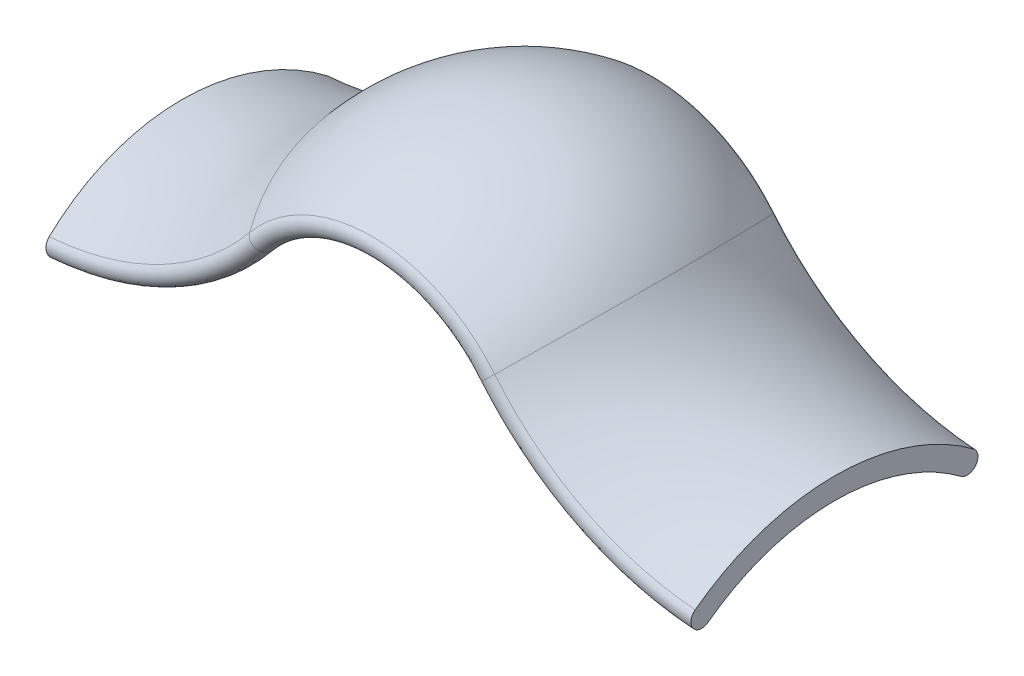
ISO-10303-21;
HEADER;
FILE_DESCRIPTION(('STEP AP214'),'2;1');
FILE_NAME('part.step','',(''),(''),'','','');
FILE_SCHEMA(('AUTOMOTIVE_DESIGN { 1 0 10303 214 1 1 1 1 }'));
ENDSEC;
DATA;
#1=APPLICATION_CONTEXT('core data for automotive mechanical design processes');
#2=APPLICATION_PROTOCOL_DEFINITION('international standard','automotive_design',2000,#1);
#3=PRODUCT_CONTEXT('',#1,'mechanical');
#4=PRODUCT('Part','Part','',(#3));
#5=PRODUCT_RELATED_PRODUCT_CATEGORY('part','',(#4));
#6=PRODUCT_DEFINITION_FORMATION('','',#4);
#7=PRODUCT_DEFINITION_CONTEXT('part definition',#1,'design');
#8=PRODUCT_DEFINITION('design','',#6,#7);
#9=PRODUCT_DEFINITION_SHAPE('','',#8);
#10=(LENGTH_UNIT() NAMED_UNIT(*) SI_UNIT(.MILLI.,.METRE.));
#11=(NAMED_UNIT(*) PLANE_ANGLE_UNIT() SI_UNIT($,.RADIAN.));
#12=(NAMED_UNIT(*) SI_UNIT($,.STERADIAN.) SOLID_ANGLE_UNIT());
#13=UNCERTAINTY_MEASURE_WITH_UNIT(LENGTH_MEASURE(1.E-05),#10,'distance_accuracy_value','');
#14=(GEOMETRIC_REPRESENTATION_CONTEXT(3) GLOBAL_UNCERTAINTY_ASSIGNED_CONTEXT((#13)) GLOBAL_UNIT_ASSIGNED_CONTEXT((#10,
#11,#12)) REPRESENTATION_CONTEXT('',''));
#15=CARTESIAN_POINT('',(0.,0.,0.));
#16=DIRECTION('',(0.,0.,1.));
#17=DIRECTION('',(1.,0.,0.));
#18=AXIS2_PLACEMENT_3D('',#15,#16,#17);
#19=CARTESIAN_POINT('',(-34.5983191968953,-0.818303723281441,0.));
#20=DIRECTION('',(0.577992953239305,0.816041755062635,0.));
#21=DIRECTION('',(0.,0.,-1.));
#22=AXIS2_PLACEMENT_3D('',#19,#20,#21);
#23=CIRCLE('',#22,27.4169496610841);
#24=CARTESIAN_POINT('',(-78.5719911577093,33.2344435861792,0.));
#25=DIRECTION('',(0.,0.,-1.));
#26=AXIS1_PLACEMENT('',#24,#25);
#27=SURFACE_OF_REVOLUTION('',#23,#26);
#28=CARTESIAN_POINT('',(-52.5245550481321,11.8786421570496,-16.4050834266758));
#29=VERTEX_POINT('',#28);
#30=CARTESIAN_POINT('',(-52.5245550481321,11.8786421570496,16.4050834266758));
#31=VERTEX_POINT('',#30);
#32=EDGE_CURVE('E157',#29,#31,#23,.T.);
#33=ORIENTED_EDGE('',*,*,#32,.F.);
#34=CARTESIAN_POINT('',(-78.5719911577093,33.2344435861792,-16.4050834266758));
#35=DIRECTION('',(0.,0.,-1.));
#36=DIRECTION('',(-1.,0.,0.));
#37=AXIS2_PLACEMENT_3D('',#34,#35,#36);
#38=CIRCLE('',#37,33.6829212296516);
#39=CARTESIAN_POINT('',(-76.1481835235366,-0.361156410181113,-16.4050834266758));
#40=VERTEX_POINT('',#39);
#41=EDGE_CURVE('E39',#29,#40,#38,.T.);
#42=ORIENTED_EDGE('',*,*,#41,.T.);
#43=CARTESIAN_POINT('',(-73.0283979719381,-22.105794935442,0.));
#44=DIRECTION('',(0.989863858347722,0.142019512521912,0.));
#45=DIRECTION('',(0.,0.,-1.));
#46=AXIS2_PLACEMENT_3D('',#43,#44,#45);
#47=CIRCLE('',#46,27.4169496610841);
#48=CARTESIAN_POINT('',(-76.1481835235366,-0.361156410181147,16.4050834266758));
#49=VERTEX_POINT('',#48);
#50=EDGE_CURVE('E46',#40,#49,#47,.T.);
#51=ORIENTED_EDGE('',*,*,#50,.T.);
#52=CARTESIAN_POINT('',(-78.5719911577093,33.2344435861792,16.4050834266758));
#53=DIRECTION('',(0.,0.,-1.));
#54=DIRECTION('',(-1.,0.,0.));
#55=AXIS2_PLACEMENT_3D('',#52,#53,#54);
#56=CIRCLE('',#55,33.6829212296517);
#57=EDGE_CURVE('E11',#31,#49,#56,.T.);
#58=ORIENTED_EDGE('',*,*,#57,.F.);
#59=EDGE_LOOP('',(#33,#42,#51,#58));
#60=FACE_BOUND('',#59,.T.);
#61=ADVANCED_FACE('F31',(#60),#27,.T.);
#62=CARTESIAN_POINT('',(-51.6941811439415,11.2904979080594,-15.6451719044451));
#63=DIRECTION('',(0.577992953239305,0.816041755062635,0.));
#64=DIRECTION('',(0.,0.,-1.));
#65=AXIS2_PLACEMENT_3D('',#62,#63,#64);
#66=CIRCLE('',#65,1.27);
#67=CARTESIAN_POINT('',(-78.5719911577093,33.2344435861792,0.));
#68=DIRECTION('',(0.,0.,-1.));
#69=AXIS1_PLACEMENT('',#67,#68);
#70=SURFACE_OF_REVOLUTION('',#66,#69);
#71=CARTESIAN_POINT('',(-50.863807239751,10.7023536590692,-14.8852603822143));
#72=VERTEX_POINT('',#71);
#73=EDGE_CURVE('E192',#72,#29,#66,.T.);
#74=ORIENTED_EDGE('',*,*,#73,.F.);
#75=CARTESIAN_POINT('',(-78.5719911577093,33.2344435861792,-14.8852603822143));
#76=DIRECTION('',(0.,0.,-1.));
#77=DIRECTION('',(-1.,0.,0.));
#78=AXIS2_PLACEMENT_3D('',#75,#76,#77);
#79=CIRCLE('',#78,35.7132822982539);
#80=CARTESIAN_POINT('',(-75.8591559183866,-2.37565410364841,-14.8852603822143));
#81=VERTEX_POINT('',#80);
#82=EDGE_CURVE('E203',#72,#81,#79,.T.);
#83=ORIENTED_EDGE('',*,*,#82,.T.);
#84=CARTESIAN_POINT('',(-76.0036697209616,-1.36840525691477,-15.6451719044451));
#85=DIRECTION('',(0.989863858347722,0.142019512521912,0.));
#86=DIRECTION('',(0.,0.,-1.));
#87=AXIS2_PLACEMENT_3D('',#84,#85,#86);
#88=CIRCLE('',#87,1.27);
#89=EDGE_CURVE('E54',#81,#40,#88,.T.);
#90=ORIENTED_EDGE('',*,*,#89,.T.);
#91=ORIENTED_EDGE('',*,*,#41,.F.);
#92=EDGE_LOOP('',(#74,#83,#90,#91));
#93=FACE_BOUND('',#92,.T.);
#94=ADVANCED_FACE('F195',(#93),#70,.T.);
#95=CARTESIAN_POINT('',(-34.5983191968953,-0.818303723281441,0.));
#96=DIRECTION('',(-0.577992953239305,-0.816041755062635,0.));
#97=DIRECTION('',(0.,0.,-1.));
#98=AXIS2_PLACEMENT_3D('',#95,#96,#97);
#99=CIRCLE('',#98,24.8769496610841);
#100=CARTESIAN_POINT('',(-78.5719911577093,33.2344435861792,0.));
#101=DIRECTION('',(0.,0.,-1.));
#102=AXIS1_PLACEMENT('',#100,#101);
#103=SURFACE_OF_REVOLUTION('',#99,#102);
#104=CARTESIAN_POINT('',(-50.8638072397509,10.7023536590692,14.8852603822143));
#105=VERTEX_POINT('',#104);
#106=EDGE_CURVE('E187',#105,#72,#99,.T.);
#107=ORIENTED_EDGE('',*,*,#106,.F.);
#108=CARTESIAN_POINT('',(-78.5719911577093,33.2344435861792,14.8852603822143));
#109=DIRECTION('',(0.,0.,-1.));
#110=DIRECTION('',(-1.,0.,0.));
#111=AXIS2_PLACEMENT_3D('',#108,#109,#110);
#112=CIRCLE('',#111,35.7132822982539);
#113=CARTESIAN_POINT('',(-75.8591559183866,-2.37565410364844,14.8852603822143));
#114=VERTEX_POINT('',#113);
#115=EDGE_CURVE('E228',#105,#114,#112,.T.);
#116=ORIENTED_EDGE('',*,*,#115,.T.);
#117=CARTESIAN_POINT('',(-73.0283979719381,-22.105794935442,0.));
#118=DIRECTION('',(-0.989863858347722,-0.142019512521912,0.));
#119=DIRECTION('',(0.,0.,-1.));
#120=AXIS2_PLACEMENT_3D('',#117,#118,#119);
#121=CIRCLE('',#120,24.8769496610841);
#122=EDGE_CURVE('E224',#114,#81,#121,.T.);
#123=ORIENTED_EDGE('',*,*,#122,.T.);
#124=ORIENTED_EDGE('',*,*,#82,.F.);
#125=EDGE_LOOP('',(#107,#116,#123,#124));
#126=FACE_BOUND('',#125,.T.);
#127=ADVANCED_FACE('F180',(#126),#103,.T.);
#128=CARTESIAN_POINT('',(-51.6941811439415,11.2904979080594,15.6451719044451));
#129=DIRECTION('',(0.577992953239305,0.816041755062635,0.));
#130=DIRECTION('',(0.,0.,1.));
#131=AXIS2_PLACEMENT_3D('',#128,#129,#130);
#132=CIRCLE('',#131,1.27);
#133=CARTESIAN_POINT('',(-78.5719911577093,33.2344435861792,0.));
#134=DIRECTION('',(0.,0.,-1.));
#135=AXIS1_PLACEMENT('',#133,#134);
#136=SURFACE_OF_REVOLUTION('',#132,#135);
#137=EDGE_CURVE('E183',#31,#105,#132,.T.);
#138=ORIENTED_EDGE('',*,*,#137,.F.);
#139=ORIENTED_EDGE('',*,*,#57,.T.);
#140=CARTESIAN_POINT('',(-76.0036697209616,-1.36840525691478,15.6451719044451));
#141=DIRECTION('',(0.989863858347722,0.142019512521912,0.));
#142=DIRECTION('',(0.,0.,1.));
#143=AXIS2_PLACEMENT_3D('',#140,#141,#142);
#144=CIRCLE('',#143,1.27);
#145=EDGE_CURVE('E222',#49,#114,#144,.T.);
#146=ORIENTED_EDGE('',*,*,#145,.T.);
#147=ORIENTED_EDGE('',*,*,#115,.F.);
#148=EDGE_LOOP('',(#138,#139,#146,#147));
#149=FACE_BOUND('',#148,.T.);
#150=ADVANCED_FACE('F175',(#149),#136,.T.);
#151=CARTESIAN_POINT('',(-37.166912119735,-0.984155770539181,-27.2139110541104));
#152=CARTESIAN_POINT('',(-5.62513185381765,28.9209200001234,-21.894591887005));
#153=CARTESIAN_POINT('',(-5.62513185381765,28.9209200001234,21.894591887005));
#154=CARTESIAN_POINT('',(-37.166912119735,-0.984155770539184,27.2139110541104));
#155=(BOUNDED_CURVE() B_SPLINE_CURVE(3,(#151,#152,#153,#154),.UNSPECIFIED.,.F.,
.F.) B_SPLINE_CURVE_WITH_KNOTS((4,4),(0.,1.),
.UNSPECIFIED.) CURVE() GEOMETRIC_REPRESENTATION_ITEM() RATIONAL_B_SPLINE_CURVE((1.,
0.414317093989202,0.414317093989202,1.)) REPRESENTATION_ITEM(''));
#156=CARTESIAN_POINT('',(-38.1,0.,0.));
#157=DIRECTION('',(0.,0.,1.));
#158=AXIS1_PLACEMENT('',#156,#157);
#159=SURFACE_OF_REVOLUTION('',#155,#158);
#160=CARTESIAN_POINT('',(-39.5837964140581,-3.27562782257029,0.));
#161=DIRECTION('',(0.688028187042774,-0.725683962779,0.));
#162=DIRECTION('',(0.,0.,-1.));
#163=AXIS2_PLACEMENT_3D('',#160,#161,#162);
#164=CIRCLE('',#163,27.4169496610841);
#165=CARTESIAN_POINT('',(-23.6424774931433,11.8384952927119,-16.4050834266758));
#166=VERTEX_POINT('',#165);
#167=CARTESIAN_POINT('',(-23.6424774931433,11.8384952927119,16.4050834266758));
#168=VERTEX_POINT('',#167);
#169=EDGE_CURVE('E109',#166,#168,#164,.T.);
#170=ORIENTED_EDGE('',*,*,#169,.F.);
#171=CARTESIAN_POINT('',(-38.1,0.,-16.4050834266758));
#172=DIRECTION('',(0.,0.,1.));
#173=DIRECTION('',(1.,0.,0.));
#174=AXIS2_PLACEMENT_3D('',#171,#172,#173);
#175=CIRCLE('',#174,18.6860891529456);
#176=EDGE_CURVE('E216',#166,#29,#175,.T.);
#177=ORIENTED_EDGE('',*,*,#176,.T.);
#178=ORIENTED_EDGE('',*,*,#32,.T.);
#179=CARTESIAN_POINT('',(-38.1,0.,16.4050834266758));
#180=DIRECTION('',(0.,0.,1.));
#181=DIRECTION('',(1.,0.,0.));
#182=AXIS2_PLACEMENT_3D('',#179,#180,#181);
#183=CIRCLE('',#182,18.6860891529455);
#184=EDGE_CURVE('E217',#168,#31,#183,.T.);
#185=ORIENTED_EDGE('',*,*,#184,.F.);
#186=EDGE_LOOP('',(#170,#177,#178,#185));
#187=FACE_BOUND('',#186,.T.);
#188=ADVANCED_FACE('F172',(#187),#159,.T.);
#189=CARTESIAN_POINT('',(-24.3809066502825,11.1383832600574,-15.6451719044451));
#190=DIRECTION('',(0.688028187042774,-0.725683962779,0.));
#191=DIRECTION('',(0.,0.,-1.));
#192=AXIS2_PLACEMENT_3D('',#189,#190,#191);
#193=CIRCLE('',#192,1.27);
#194=CARTESIAN_POINT('',(-38.1,0.,0.));
#195=DIRECTION('',(0.,0.,1.));
#196=AXIS1_PLACEMENT('',#194,#195);
#197=SURFACE_OF_REVOLUTION('',#193,#196);
#198=CARTESIAN_POINT('',(-25.1193358074217,10.4382712274029,-14.8852603822143));
#199=VERTEX_POINT('',#198);
#200=EDGE_CURVE('E215',#199,#166,#193,.T.);
#201=ORIENTED_EDGE('',*,*,#200,.F.);
#202=CARTESIAN_POINT('',(-38.1,0.,-14.8852603822143));
#203=DIRECTION('',(0.,0.,1.));
#204=DIRECTION('',(1.,0.,0.));
#205=AXIS2_PLACEMENT_3D('',#202,#203,#204);
#206=CIRCLE('',#205,16.6569849942092);
#207=EDGE_CURVE('E211',#199,#72,#206,.T.);
#208=ORIENTED_EDGE('',*,*,#207,.T.);
#209=ORIENTED_EDGE('',*,*,#73,.T.);
#210=ORIENTED_EDGE('',*,*,#176,.F.);
#211=EDGE_LOOP('',(#201,#208,#209,#210));
#212=FACE_BOUND('',#211,.T.);
#213=ADVANCED_FACE('F150',(#212),#197,.T.);
#214=CARTESIAN_POINT('',(-37.166912119735,-0.984155770539186,24.6530008433603));
#215=CARTESIAN_POINT('',(-9.19746511569019,25.5339552830496,19.4461528676298));
#216=CARTESIAN_POINT('',(-9.19746511569019,25.5339552830496,-19.4461528676298));
#217=CARTESIAN_POINT('',(-37.166912119735,-0.98415577053918,-24.6530008433603));
#218=(BOUNDED_CURVE() B_SPLINE_CURVE(3,(#214,#215,#216,#217),.UNSPECIFIED.,.F.,
.F.) B_SPLINE_CURVE_WITH_KNOTS((4,4),(0.,1.),
.UNSPECIFIED.) CURVE() GEOMETRIC_REPRESENTATION_ITEM() RATIONAL_B_SPLINE_CURVE((1.,
0.422585742471764,0.422585742471764,1.)) REPRESENTATION_ITEM(''));
#219=CARTESIAN_POINT('',(-38.1,0.,0.));
#220=DIRECTION('',(0.,0.,1.));
#221=AXIS1_PLACEMENT('',#219,#220);
#222=SURFACE_OF_REVOLUTION('',#218,#221);
#223=CARTESIAN_POINT('',(-39.5837964140581,-3.27562782257029,0.));
#224=DIRECTION('',(-0.688028187042774,0.725683962779,0.));
#225=DIRECTION('',(0.,0.,-1.));
#226=AXIS2_PLACEMENT_3D('',#223,#224,#225);
#227=CIRCLE('',#226,24.8769496610841);
#228=CARTESIAN_POINT('',(-25.1193358074217,10.4382712274028,14.8852603822143));
#229=VERTEX_POINT('',#228);
#230=EDGE_CURVE('E130',#229,#199,#227,.T.);
#231=ORIENTED_EDGE('',*,*,#230,.F.);
#232=CARTESIAN_POINT('',(-38.1,0.,14.8852603822143));
#233=DIRECTION('',(0.,0.,1.));
#234=DIRECTION('',(1.,0.,0.));
#235=AXIS2_PLACEMENT_3D('',#232,#233,#234);
#236=CIRCLE('',#235,16.6569849942092);
#237=EDGE_CURVE('E167',#229,#105,#236,.T.);
#238=ORIENTED_EDGE('',*,*,#237,.T.);
#239=ORIENTED_EDGE('',*,*,#106,.T.);
#240=ORIENTED_EDGE('',*,*,#207,.F.);
#241=EDGE_LOOP('',(#231,#238,#239,#240));
#242=FACE_BOUND('',#241,.T.);
#243=ADVANCED_FACE('F142',(#242),#222,.T.);
#244=CARTESIAN_POINT('',(-24.3809066502825,11.1383832600574,15.6451719044451));
#245=DIRECTION('',(0.688028187042774,-0.725683962779,0.));
#246=DIRECTION('',(0.,0.,1.));
#247=AXIS2_PLACEMENT_3D('',#244,#245,#246);
#248=CIRCLE('',#247,1.27);
#249=CARTESIAN_POINT('',(-38.1,0.,0.));
#250=DIRECTION('',(0.,0.,1.));
#251=AXIS1_PLACEMENT('',#249,#250);
#252=SURFACE_OF_REVOLUTION('',#248,#251);
#253=EDGE_CURVE('E105',#168,#229,#248,.T.);
#254=ORIENTED_EDGE('',*,*,#253,.F.);
#255=ORIENTED_EDGE('',*,*,#184,.T.);
#256=ORIENTED_EDGE('',*,*,#137,.T.);
#257=ORIENTED_EDGE('',*,*,#237,.F.);
#258=EDGE_LOOP('',(#254,#255,#256,#257));
#259=FACE_BOUND('',#258,.T.);
#260=ADVANCED_FACE('F138',(#259),#252,.T.);
#261=CARTESIAN_POINT('',(2.37199115770929,33.2344435861792,0.));
#262=DIRECTION('',(0.,0.,1.));
#263=AXIS1_PLACEMENT('',#261,#262);
#264=SURFACE_OF_REVOLUTION('',#248,#263);
#265=CARTESIAN_POINT('',(2.37199115770929,33.2344435861792,16.4050834266758));
#266=DIRECTION('',(0.,0.,1.));
#267=DIRECTION('',(1.,0.,0.));
#268=AXIS2_PLACEMENT_3D('',#265,#266,#267);
#269=CIRCLE('',#268,33.6829212296517);
#270=CARTESIAN_POINT('',(0.,-0.364854628376859,16.4050834266758));
#271=VERTEX_POINT('',#270);
#272=EDGE_CURVE('E188',#168,#271,#269,.T.);
#273=ORIENTED_EDGE('',*,*,#272,.F.);
#274=ORIENTED_EDGE('',*,*,#253,.T.);
#275=CARTESIAN_POINT('',(2.37199115770929,33.2344435861792,14.8852603822143));
#276=DIRECTION('',(0.,0.,1.));
#277=DIRECTION('',(1.,0.,0.));
#278=AXIS2_PLACEMENT_3D('',#275,#276,#277);
#279=CIRCLE('',#278,35.7132822982539);
#280=CARTESIAN_POINT('',(0.,-2.39998064745375,14.8852603822143));
#281=VERTEX_POINT('',#280);
#282=EDGE_CURVE('E98',#229,#281,#279,.T.);
#283=ORIENTED_EDGE('',*,*,#282,.T.);
#284=CARTESIAN_POINT('',(0.,-1.3824176379153,15.6451719044451));
#285=DIRECTION('',(1.,0.,0.));
#286=DIRECTION('',(0.,0.,1.));
#287=AXIS2_PLACEMENT_3D('',#284,#285,#286);
#288=CIRCLE('',#287,1.27);
#289=EDGE_CURVE('E103',#271,#281,#288,.T.);
#290=ORIENTED_EDGE('',*,*,#289,.F.);
#291=EDGE_LOOP('',(#273,#274,#283,#290));
#292=FACE_BOUND('',#291,.T.);
#293=ADVANCED_FACE('F101',(#292),#264,.F.);
#294=CARTESIAN_POINT('',(2.37199115770929,33.2344435861792,0.));
#295=DIRECTION('',(0.,0.,1.));
#296=AXIS1_PLACEMENT('',#294,#295);
#297=SURFACE_OF_REVOLUTION('',#164,#296);
#298=CARTESIAN_POINT('',(2.37199115770929,33.2344435861792,-16.4050834266758));
#299=DIRECTION('',(0.,0.,1.));
#300=DIRECTION('',(1.,0.,0.));
#301=AXIS2_PLACEMENT_3D('',#298,#299,#300);
#302=CIRCLE('',#301,33.6829212296516);
#303=CARTESIAN_POINT('',(0.,-0.364854628376833,-16.4050834266758));
#304=VERTEX_POINT('',#303);
#305=EDGE_CURVE('E235',#166,#304,#302,.T.);
#306=ORIENTED_EDGE('',*,*,#305,.F.);
#307=ORIENTED_EDGE('',*,*,#169,.T.);
#308=ORIENTED_EDGE('',*,*,#272,.T.);
#309=CARTESIAN_POINT('',(0.,-22.332156840579,0.));
#310=DIRECTION('',(1.,0.,0.));
#311=DIRECTION('',(0.,0.,-1.));
#312=AXIS2_PLACEMENT_3D('',#309,#310,#311);
#313=CIRCLE('',#312,27.4169496610841);
#314=EDGE_CURVE('E123',#304,#271,#313,.T.);
#315=ORIENTED_EDGE('',*,*,#314,.F.);
#316=EDGE_LOOP('',(#306,#307,#308,#315));
#317=FACE_BOUND('',#316,.T.);
#318=ADVANCED_FACE('F144',(#317),#297,.F.);
#319=CARTESIAN_POINT('',(2.37199115770929,33.2344435861792,0.));
#320=DIRECTION('',(0.,0.,1.));
#321=AXIS1_PLACEMENT('',#319,#320);
#322=SURFACE_OF_REVOLUTION('',#193,#321);
#323=CARTESIAN_POINT('',(2.37199115770929,33.2344435861792,-14.8852603822143));
#324=DIRECTION('',(0.,0.,1.));
#325=DIRECTION('',(1.,0.,0.));
#326=AXIS2_PLACEMENT_3D('',#323,#324,#325);
#327=CIRCLE('',#326,35.7132822982539);
#328=CARTESIAN_POINT('',(0.,-2.39998064745373,-14.8852603822143));
#329=VERTEX_POINT('',#328);
#330=EDGE_CURVE('E108',#199,#329,#327,.T.);
#331=ORIENTED_EDGE('',*,*,#330,.F.);
#332=ORIENTED_EDGE('',*,*,#200,.T.);
#333=ORIENTED_EDGE('',*,*,#305,.T.);
#334=CARTESIAN_POINT('',(0.,-1.38241763791528,-15.6451719044451));
#335=DIRECTION('',(1.,0.,0.));
#336=DIRECTION('',(0.,0.,-1.));
#337=AXIS2_PLACEMENT_3D('',#334,#335,#336);
#338=CIRCLE('',#337,1.27);
#339=EDGE_CURVE('E118',#329,#304,#338,.T.);
#340=ORIENTED_EDGE('',*,*,#339,.F.);
#341=EDGE_LOOP('',(#331,#332,#333,#340));
#342=FACE_BOUND('',#341,.T.);
#343=ADVANCED_FACE('F241',(#342),#322,.F.);
#344=CARTESIAN_POINT('',(2.37199115770929,33.2344435861792,0.));
#345=DIRECTION('',(0.,0.,1.));
#346=AXIS1_PLACEMENT('',#344,#345);
#347=SURFACE_OF_REVOLUTION('',#227,#346);
#348=ORIENTED_EDGE('',*,*,#230,.T.);
#349=ORIENTED_EDGE('',*,*,#330,.T.);
#350=CARTESIAN_POINT('',(0.,-22.332156840579,0.));
#351=DIRECTION('',(-1.,0.,0.));
#352=DIRECTION('',(0.,0.,-1.));
#353=AXIS2_PLACEMENT_3D('',#350,#351,#352);
#354=CIRCLE('',#353,24.8769496610841);
#355=EDGE_CURVE('E112',#281,#329,#354,.T.);
#356=ORIENTED_EDGE('',*,*,#355,.F.);
#357=ORIENTED_EDGE('',*,*,#282,.F.);
#358=EDGE_LOOP('',(#348,#349,#356,#357));
#359=FACE_BOUND('',#358,.T.);
#360=ADVANCED_FACE('F113',(#359),#347,.F.);
#361=CARTESIAN_POINT('',(-74.5160338464498,-11.7371000961784,7.82258595222254));
#362=DIRECTION('',(-0.989863858347722,-0.142019512521912,0.));
#363=DIRECTION('',(0.,0.,1.));
#364=AXIS2_PLACEMENT_3D('',#361,#362,#363);
#365=PLANE('',#364);
#366=ORIENTED_EDGE('',*,*,#145,.F.);
#367=ORIENTED_EDGE('',*,*,#50,.F.);
#368=ORIENTED_EDGE('',*,*,#89,.F.);
#369=ORIENTED_EDGE('',*,*,#122,.F.);
#370=EDGE_LOOP('',(#366,#367,#368,#369));
#371=FACE_BOUND('',#370,.T.);
#372=ADVANCED_FACE('F243',(#371),#365,.T.);
#373=CARTESIAN_POINT('',(0.,-11.8572872392472,7.82258595222254));
#374=DIRECTION('',(-1.,0.,0.));
#375=DIRECTION('',(0.,0.,1.));
#376=AXIS2_PLACEMENT_3D('',#373,#374,#375);
#377=PLANE('',#376);
#378=ORIENTED_EDGE('',*,*,#289,.T.);
#379=ORIENTED_EDGE('',*,*,#355,.T.);
#380=ORIENTED_EDGE('',*,*,#339,.T.);
#381=ORIENTED_EDGE('',*,*,#314,.T.);
#382=EDGE_LOOP('',(#378,#379,#380,#381));
#383=FACE_BOUND('',#382,.T.);
#384=ADVANCED_FACE('F121',(#383),#377,.F.);
#385=CLOSED_SHELL('',(#61,#94,#127,#150,#188,#213,#243,#260,#293,#318,#343,#360,#372,#384));
#386=MANIFOLD_SOLID_BREP('B2',#385);
#387=ADVANCED_BREP_SHAPE_REPRESENTATION('',(#18,#386),#14);
#388=SHAPE_DEFINITION_REPRESENTATION(#9,#387);
ENDSEC;
END-ISO-10303-21;
